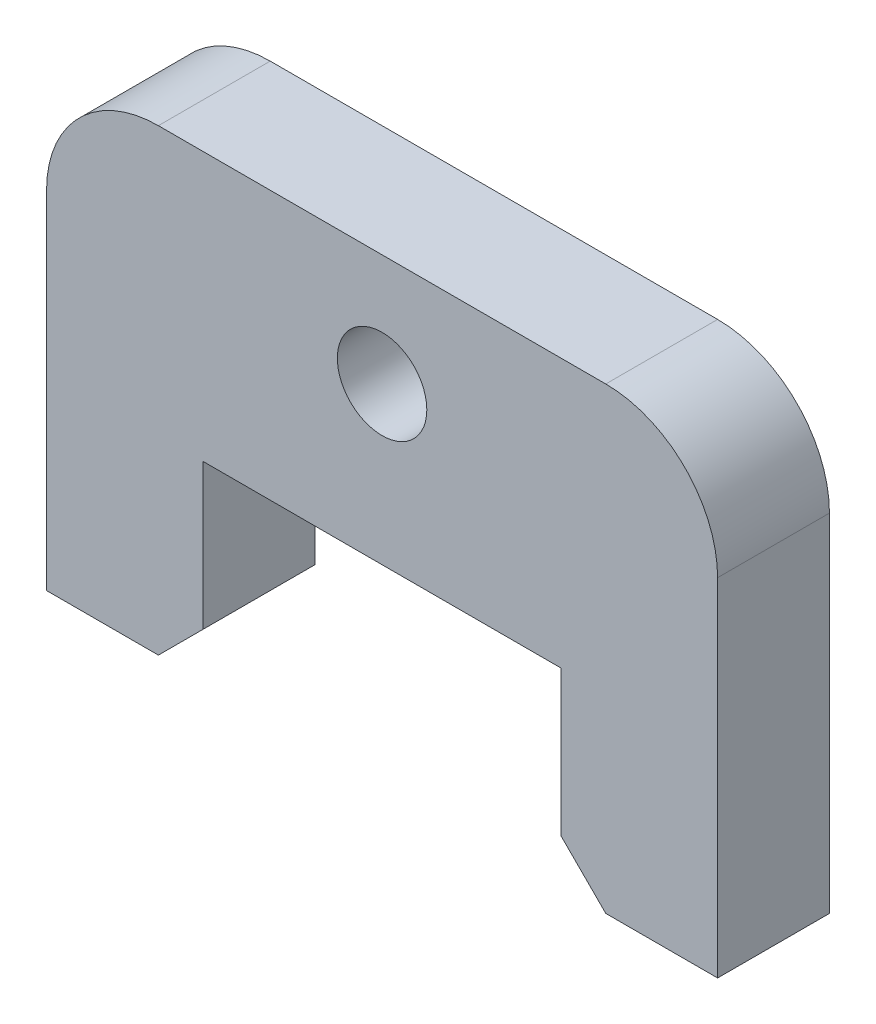
ISO-10303-21;
HEADER;
FILE_DESCRIPTION(('STEP AP214'),'2;1');
FILE_NAME('part.step','',(''),(''),'','','');
FILE_SCHEMA(('AUTOMOTIVE_DESIGN { 1 0 10303 214 1 1 1 1 }'));
ENDSEC;
DATA;
#1=APPLICATION_CONTEXT('core data for automotive mechanical design processes');
#2=APPLICATION_PROTOCOL_DEFINITION('international standard','automotive_design',2000,#1);
#3=PRODUCT_CONTEXT('',#1,'mechanical');
#4=PRODUCT('Part','Part','',(#3));
#5=PRODUCT_RELATED_PRODUCT_CATEGORY('part','',(#4));
#6=PRODUCT_DEFINITION_FORMATION('','',#4);
#7=PRODUCT_DEFINITION_CONTEXT('part definition',#1,'design');
#8=PRODUCT_DEFINITION('design','',#6,#7);
#9=PRODUCT_DEFINITION_SHAPE('','',#8);
#10=(LENGTH_UNIT() NAMED_UNIT(*) SI_UNIT(.MILLI.,.METRE.));
#11=(NAMED_UNIT(*) PLANE_ANGLE_UNIT() SI_UNIT($,.RADIAN.));
#12=(NAMED_UNIT(*) SI_UNIT($,.STERADIAN.) SOLID_ANGLE_UNIT());
#13=UNCERTAINTY_MEASURE_WITH_UNIT(LENGTH_MEASURE(1.E-05),#10,'distance_accuracy_value','');
#14=(GEOMETRIC_REPRESENTATION_CONTEXT(3) GLOBAL_UNCERTAINTY_ASSIGNED_CONTEXT((#13)) GLOBAL_UNIT_ASSIGNED_CONTEXT((#10,
#11,#12)) REPRESENTATION_CONTEXT('',''));
#15=CARTESIAN_POINT('',(0.,0.,0.));
#16=DIRECTION('',(0.,0.,1.));
#17=DIRECTION('',(1.,0.,0.));
#18=AXIS2_PLACEMENT_3D('',#15,#16,#17);
#19=CARTESIAN_POINT('',(50.0044487630317,31.,10.));
#20=DIRECTION('',(0.,0.,1.));
#21=DIRECTION('',(1.,0.,0.));
#22=AXIS2_PLACEMENT_3D('',#19,#20,#21);
#23=PLANE('',#22);
#24=DIRECTION('',(1.,0.,0.));
#25=VECTOR('',#24,1.);
#26=CARTESIAN_POINT('',(0.,0.,10.));
#27=LINE('',#26,#25);
#28=CARTESIAN_POINT('',(0.,0.,10.));
#29=VERTEX_POINT('',#28);
#30=CARTESIAN_POINT('',(10.,0.,10.));
#31=VERTEX_POINT('',#30);
#32=EDGE_CURVE('E183',#29,#31,#27,.T.);
#33=ORIENTED_EDGE('',*,*,#32,.T.);
#34=DIRECTION('',(0.707106781186548,0.707106781186547,0.));
#35=VECTOR('',#34,1.);
#36=CARTESIAN_POINT('',(10.,0.,10.));
#37=LINE('',#36,#35);
#38=CARTESIAN_POINT('',(14.0022243815159,4.00222438151586,10.));
#39=VERTEX_POINT('',#38);
#40=EDGE_CURVE('E111',#31,#39,#37,.T.);
#41=ORIENTED_EDGE('',*,*,#40,.T.);
#42=DIRECTION('',(0.,1.,0.));
#43=VECTOR('',#42,1.);
#44=CARTESIAN_POINT('',(14.0022243815159,4.00222438151586,10.));
#45=LINE('',#44,#43);
#46=CARTESIAN_POINT('',(14.0022243815159,17.,10.));
#47=VERTEX_POINT('',#46);
#48=EDGE_CURVE('E210',#39,#47,#45,.T.);
#49=ORIENTED_EDGE('',*,*,#48,.T.);
#50=DIRECTION('',(1.,0.,0.));
#51=VECTOR('',#50,1.);
#52=CARTESIAN_POINT('',(14.0022243815159,17.,10.));
#53=LINE('',#52,#51);
#54=CARTESIAN_POINT('',(46.0022243815159,17.,10.));
#55=VERTEX_POINT('',#54);
#56=EDGE_CURVE('E229',#47,#55,#53,.T.);
#57=ORIENTED_EDGE('',*,*,#56,.T.);
#58=DIRECTION('',(0.,-1.,0.));
#59=VECTOR('',#58,1.);
#60=CARTESIAN_POINT('',(46.0022243815159,17.,10.));
#61=LINE('',#60,#59);
#62=CARTESIAN_POINT('',(46.0022243815159,4.00222438151586,10.));
#63=VERTEX_POINT('',#62);
#64=EDGE_CURVE('E226',#55,#63,#61,.T.);
#65=ORIENTED_EDGE('',*,*,#64,.T.);
#66=DIRECTION('',(0.707106781186548,-0.707106781186548,0.));
#67=VECTOR('',#66,1.);
#68=CARTESIAN_POINT('',(46.0022243815159,4.00222438151586,10.));
#69=LINE('',#68,#67);
#70=CARTESIAN_POINT('',(50.0044487630317,0.,10.));
#71=VERTEX_POINT('',#70);
#72=EDGE_CURVE('E228',#63,#71,#69,.T.);
#73=ORIENTED_EDGE('',*,*,#72,.T.);
#74=DIRECTION('',(1.,0.,0.));
#75=VECTOR('',#74,1.);
#76=CARTESIAN_POINT('',(50.0044487630317,0.,10.));
#77=LINE('',#76,#75);
#78=CARTESIAN_POINT('',(60.0044487630317,0.,10.));
#79=VERTEX_POINT('',#78);
#80=EDGE_CURVE('E231',#71,#79,#77,.T.);
#81=ORIENTED_EDGE('',*,*,#80,.T.);
#82=DIRECTION('',(0.,1.,0.));
#83=VECTOR('',#82,1.);
#84=CARTESIAN_POINT('',(60.0044487630317,0.,10.));
#85=LINE('',#84,#83);
#86=CARTESIAN_POINT('',(60.0044487630317,30.9999999999999,10.));
#87=VERTEX_POINT('',#86);
#88=EDGE_CURVE('E237',#79,#87,#85,.T.);
#89=ORIENTED_EDGE('',*,*,#88,.T.);
#90=CARTESIAN_POINT('',(50.0044487630317,31.,10.));
#91=DIRECTION('',(0.,0.,1.));
#92=DIRECTION('',(1.,0.,0.));
#93=AXIS2_PLACEMENT_3D('',#90,#91,#92);
#94=CIRCLE('',#93,10.);
#95=CARTESIAN_POINT('',(50.0044487630317,41.,10.));
#96=VERTEX_POINT('',#95);
#97=EDGE_CURVE('E142',#87,#96,#94,.T.);
#98=ORIENTED_EDGE('',*,*,#97,.T.);
#99=DIRECTION('',(-1.,0.,0.));
#100=VECTOR('',#99,1.);
#101=CARTESIAN_POINT('',(50.0044487630317,41.,10.));
#102=LINE('',#101,#100);
#103=CARTESIAN_POINT('',(10.0000000000001,41.,10.));
#104=VERTEX_POINT('',#103);
#105=EDGE_CURVE('E136',#96,#104,#102,.T.);
#106=ORIENTED_EDGE('',*,*,#105,.T.);
#107=CARTESIAN_POINT('',(10.,31.,10.));
#108=DIRECTION('',(0.,0.,1.));
#109=DIRECTION('',(-1.,0.,0.));
#110=AXIS2_PLACEMENT_3D('',#107,#108,#109);
#111=CIRCLE('',#110,10.);
#112=CARTESIAN_POINT('',(0.,30.9999999999999,10.));
#113=VERTEX_POINT('',#112);
#114=EDGE_CURVE('E140',#104,#113,#111,.T.);
#115=ORIENTED_EDGE('',*,*,#114,.T.);
#116=DIRECTION('',(0.,-1.,0.));
#117=VECTOR('',#116,1.);
#118=CARTESIAN_POINT('',(0.,0.,10.));
#119=LINE('',#118,#117);
#120=EDGE_CURVE('E56',#113,#29,#119,.T.);
#121=ORIENTED_EDGE('',*,*,#120,.T.);
#122=EDGE_LOOP('',(#33,#41,#49,#57,#65,#73,#81,#89,#98,#106,#115,#121));
#123=FACE_BOUND('',#122,.T.);
#124=CARTESIAN_POINT('',(30.0022243815159,31.,10.));
#125=DIRECTION('',(0.,0.,1.));
#126=DIRECTION('',(1.,0.,0.));
#127=AXIS2_PLACEMENT_3D('',#124,#125,#126);
#128=CIRCLE('',#127,4.00000000000001);
#129=CARTESIAN_POINT('',(34.0022243815159,31.,10.));
#130=VERTEX_POINT('',#129);
#131=EDGE_CURVE('E164',#130,#130,#128,.T.);
#132=ORIENTED_EDGE('',*,*,#131,.F.);
#133=EDGE_LOOP('',(#132));
#134=FACE_BOUND('',#133,.T.);
#135=ADVANCED_FACE('F39',(#123,#134),#23,.T.);
#136=CARTESIAN_POINT('',(50.0044487630317,31.,0.));
#137=DIRECTION('',(0.,0.,1.));
#138=DIRECTION('',(1.,0.,0.));
#139=AXIS2_PLACEMENT_3D('',#136,#137,#138);
#140=PLANE('',#139);
#141=DIRECTION('',(1.,0.,0.));
#142=VECTOR('',#141,1.);
#143=CARTESIAN_POINT('',(0.,0.,0.));
#144=LINE('',#143,#142);
#145=CARTESIAN_POINT('',(0.,0.,0.));
#146=VERTEX_POINT('',#145);
#147=CARTESIAN_POINT('',(10.,0.,0.));
#148=VERTEX_POINT('',#147);
#149=EDGE_CURVE('E160',#146,#148,#144,.T.);
#150=ORIENTED_EDGE('',*,*,#149,.F.);
#151=DIRECTION('',(0.,-1.,0.));
#152=VECTOR('',#151,1.);
#153=CARTESIAN_POINT('',(0.,0.,0.));
#154=LINE('',#153,#152);
#155=CARTESIAN_POINT('',(0.,30.9999999999999,0.));
#156=VERTEX_POINT('',#155);
#157=EDGE_CURVE('E103',#156,#146,#154,.T.);
#158=ORIENTED_EDGE('',*,*,#157,.F.);
#159=CARTESIAN_POINT('',(10.,31.,0.));
#160=DIRECTION('',(0.,0.,1.));
#161=DIRECTION('',(-1.,0.,0.));
#162=AXIS2_PLACEMENT_3D('',#159,#160,#161);
#163=CIRCLE('',#162,10.);
#164=CARTESIAN_POINT('',(10.0000000000001,41.,0.));
#165=VERTEX_POINT('',#164);
#166=EDGE_CURVE('E97',#165,#156,#163,.T.);
#167=ORIENTED_EDGE('',*,*,#166,.F.);
#168=DIRECTION('',(-1.,0.,0.));
#169=VECTOR('',#168,1.);
#170=CARTESIAN_POINT('',(50.0044487630317,41.,0.));
#171=LINE('',#170,#169);
#172=CARTESIAN_POINT('',(50.0044487630317,41.,0.));
#173=VERTEX_POINT('',#172);
#174=EDGE_CURVE('E150',#173,#165,#171,.T.);
#175=ORIENTED_EDGE('',*,*,#174,.F.);
#176=CARTESIAN_POINT('',(50.0044487630317,31.,0.));
#177=DIRECTION('',(0.,0.,1.));
#178=DIRECTION('',(1.,0.,0.));
#179=AXIS2_PLACEMENT_3D('',#176,#177,#178);
#180=CIRCLE('',#179,10.);
#181=CARTESIAN_POINT('',(60.0044487630317,30.9999999999999,0.));
#182=VERTEX_POINT('',#181);
#183=EDGE_CURVE('E178',#182,#173,#180,.T.);
#184=ORIENTED_EDGE('',*,*,#183,.F.);
#185=DIRECTION('',(0.,1.,0.));
#186=VECTOR('',#185,1.);
#187=CARTESIAN_POINT('',(60.0044487630317,0.,0.));
#188=LINE('',#187,#186);
#189=CARTESIAN_POINT('',(60.0044487630317,0.,0.));
#190=VERTEX_POINT('',#189);
#191=EDGE_CURVE('E176',#190,#182,#188,.T.);
#192=ORIENTED_EDGE('',*,*,#191,.F.);
#193=DIRECTION('',(1.,0.,0.));
#194=VECTOR('',#193,1.);
#195=CARTESIAN_POINT('',(50.0044487630317,0.,0.));
#196=LINE('',#195,#194);
#197=CARTESIAN_POINT('',(50.0044487630317,0.,0.));
#198=VERTEX_POINT('',#197);
#199=EDGE_CURVE('E174',#198,#190,#196,.T.);
#200=ORIENTED_EDGE('',*,*,#199,.F.);
#201=DIRECTION('',(0.707106781186548,-0.707106781186548,0.));
#202=VECTOR('',#201,1.);
#203=CARTESIAN_POINT('',(46.0022243815159,4.00222438151586,0.));
#204=LINE('',#203,#202);
#205=CARTESIAN_POINT('',(46.0022243815159,4.00222438151586,0.));
#206=VERTEX_POINT('',#205);
#207=EDGE_CURVE('E172',#206,#198,#204,.T.);
#208=ORIENTED_EDGE('',*,*,#207,.F.);
#209=DIRECTION('',(0.,-1.,0.));
#210=VECTOR('',#209,1.);
#211=CARTESIAN_POINT('',(46.0022243815159,17.,0.));
#212=LINE('',#211,#210);
#213=CARTESIAN_POINT('',(46.0022243815159,17.,0.));
#214=VERTEX_POINT('',#213);
#215=EDGE_CURVE('E170',#214,#206,#212,.T.);
#216=ORIENTED_EDGE('',*,*,#215,.F.);
#217=DIRECTION('',(1.,0.,0.));
#218=VECTOR('',#217,1.);
#219=CARTESIAN_POINT('',(14.0022243815159,17.,0.));
#220=LINE('',#219,#218);
#221=CARTESIAN_POINT('',(14.0022243815159,17.,0.));
#222=VERTEX_POINT('',#221);
#223=EDGE_CURVE('E168',#222,#214,#220,.T.);
#224=ORIENTED_EDGE('',*,*,#223,.F.);
#225=DIRECTION('',(0.,1.,0.));
#226=VECTOR('',#225,1.);
#227=CARTESIAN_POINT('',(14.0022243815159,4.00222438151586,0.));
#228=LINE('',#227,#226);
#229=CARTESIAN_POINT('',(14.0022243815159,4.00222438151586,0.));
#230=VERTEX_POINT('',#229);
#231=EDGE_CURVE('E166',#230,#222,#228,.T.);
#232=ORIENTED_EDGE('',*,*,#231,.F.);
#233=DIRECTION('',(0.707106781186548,0.707106781186547,0.));
#234=VECTOR('',#233,1.);
#235=CARTESIAN_POINT('',(10.,0.,0.));
#236=LINE('',#235,#234);
#237=EDGE_CURVE('E163',#148,#230,#236,.T.);
#238=ORIENTED_EDGE('',*,*,#237,.F.);
#239=EDGE_LOOP('',(#150,#158,#167,#175,#184,#192,#200,#208,#216,#224,#232,#238));
#240=FACE_BOUND('',#239,.T.);
#241=CARTESIAN_POINT('',(30.0022243815159,31.,0.));
#242=DIRECTION('',(0.,0.,1.));
#243=DIRECTION('',(1.,0.,0.));
#244=AXIS2_PLACEMENT_3D('',#241,#242,#243);
#245=CIRCLE('',#244,4.00000000000001);
#246=CARTESIAN_POINT('',(34.0022243815159,31.,0.));
#247=VERTEX_POINT('',#246);
#248=EDGE_CURVE('E299',#247,#247,#245,.T.);
#249=ORIENTED_EDGE('',*,*,#248,.T.);
#250=EDGE_LOOP('',(#249));
#251=FACE_BOUND('',#250,.T.);
#252=ADVANCED_FACE('F214',(#240,#251),#140,.F.);
#253=CARTESIAN_POINT('',(0.,0.,10.));
#254=DIRECTION('',(0.,1.,0.));
#255=DIRECTION('',(0.,0.,1.));
#256=AXIS2_PLACEMENT_3D('',#253,#254,#255);
#257=PLANE('',#256);
#258=CARTESIAN_POINT('',(5.,0.,5.));
#259=DIRECTION('',(0.,-1.,0.));
#260=DIRECTION('',(0.,0.,-1.));
#261=AXIS2_PLACEMENT_3D('',#258,#259,#260);
#262=CIRCLE('',#261,2.5);
#263=CARTESIAN_POINT('',(5.,0.,2.5));
#264=VERTEX_POINT('',#263);
#265=EDGE_CURVE('E290',#264,#264,#262,.T.);
#266=ORIENTED_EDGE('',*,*,#265,.F.);
#267=EDGE_LOOP('',(#266));
#268=FACE_BOUND('',#267,.T.);
#269=ORIENTED_EDGE('',*,*,#149,.T.);
#270=DIRECTION('',(0.,0.,-1.));
#271=VECTOR('',#270,1.);
#272=CARTESIAN_POINT('',(10.,0.,10.));
#273=LINE('',#272,#271);
#274=EDGE_CURVE('E11',#31,#148,#273,.T.);
#275=ORIENTED_EDGE('',*,*,#274,.F.);
#276=ORIENTED_EDGE('',*,*,#32,.F.);
#277=DIRECTION('',(0.,0.,-1.));
#278=VECTOR('',#277,1.);
#279=CARTESIAN_POINT('',(0.,0.,10.));
#280=LINE('',#279,#278);
#281=EDGE_CURVE('E156',#29,#146,#280,.T.);
#282=ORIENTED_EDGE('',*,*,#281,.T.);
#283=EDGE_LOOP('',(#269,#275,#276,#282));
#284=FACE_BOUND('',#283,.T.);
#285=ADVANCED_FACE('F41',(#268,#284),#257,.F.);
#286=CARTESIAN_POINT('',(10.,0.,10.));
#287=DIRECTION('',(-0.707106781186547,0.707106781186548,0.));
#288=DIRECTION('',(-0.707106781186548,-0.707106781186547,0.));
#289=AXIS2_PLACEMENT_3D('',#286,#287,#288);
#290=PLANE('',#289);
#291=ORIENTED_EDGE('',*,*,#237,.T.);
#292=DIRECTION('',(0.,0.,-1.));
#293=VECTOR('',#292,1.);
#294=CARTESIAN_POINT('',(14.0022243815159,4.00222438151586,10.));
#295=LINE('',#294,#293);
#296=EDGE_CURVE('E48',#39,#230,#295,.T.);
#297=ORIENTED_EDGE('',*,*,#296,.F.);
#298=ORIENTED_EDGE('',*,*,#40,.F.);
#299=ORIENTED_EDGE('',*,*,#274,.T.);
#300=EDGE_LOOP('',(#291,#297,#298,#299));
#301=FACE_BOUND('',#300,.T.);
#302=ADVANCED_FACE('F333',(#301),#290,.F.);
#303=CARTESIAN_POINT('',(14.0022243815159,4.00222438151586,10.));
#304=DIRECTION('',(-1.,0.,0.));
#305=DIRECTION('',(0.,0.,1.));
#306=AXIS2_PLACEMENT_3D('',#303,#304,#305);
#307=PLANE('',#306);
#308=ORIENTED_EDGE('',*,*,#231,.T.);
#309=DIRECTION('',(0.,0.,-1.));
#310=VECTOR('',#309,1.);
#311=CARTESIAN_POINT('',(14.0022243815159,17.,10.));
#312=LINE('',#311,#310);
#313=EDGE_CURVE('E202',#47,#222,#312,.T.);
#314=ORIENTED_EDGE('',*,*,#313,.F.);
#315=ORIENTED_EDGE('',*,*,#48,.F.);
#316=ORIENTED_EDGE('',*,*,#296,.T.);
#317=EDGE_LOOP('',(#308,#314,#315,#316));
#318=FACE_BOUND('',#317,.T.);
#319=ADVANCED_FACE('F208',(#318),#307,.F.);
#320=CARTESIAN_POINT('',(14.0022243815159,17.,10.));
#321=DIRECTION('',(0.,1.,0.));
#322=DIRECTION('',(0.,0.,1.));
#323=AXIS2_PLACEMENT_3D('',#320,#321,#322);
#324=PLANE('',#323);
#325=ORIENTED_EDGE('',*,*,#223,.T.);
#326=DIRECTION('',(0.,0.,-1.));
#327=VECTOR('',#326,1.);
#328=CARTESIAN_POINT('',(46.0022243815159,17.,10.));
#329=LINE('',#328,#327);
#330=EDGE_CURVE('E199',#55,#214,#329,.T.);
#331=ORIENTED_EDGE('',*,*,#330,.F.);
#332=ORIENTED_EDGE('',*,*,#56,.F.);
#333=ORIENTED_EDGE('',*,*,#313,.T.);
#334=EDGE_LOOP('',(#325,#331,#332,#333));
#335=FACE_BOUND('',#334,.T.);
#336=ADVANCED_FACE('F220',(#335),#324,.F.);
#337=CARTESIAN_POINT('',(46.0022243815159,17.,10.));
#338=DIRECTION('',(1.,0.,0.));
#339=DIRECTION('',(0.,0.,-1.));
#340=AXIS2_PLACEMENT_3D('',#337,#338,#339);
#341=PLANE('',#340);
#342=ORIENTED_EDGE('',*,*,#215,.T.);
#343=DIRECTION('',(0.,0.,-1.));
#344=VECTOR('',#343,1.);
#345=CARTESIAN_POINT('',(46.0022243815159,4.00222438151586,10.));
#346=LINE('',#345,#344);
#347=EDGE_CURVE('E196',#63,#206,#346,.T.);
#348=ORIENTED_EDGE('',*,*,#347,.F.);
#349=ORIENTED_EDGE('',*,*,#64,.F.);
#350=ORIENTED_EDGE('',*,*,#330,.T.);
#351=EDGE_LOOP('',(#342,#348,#349,#350));
#352=FACE_BOUND('',#351,.T.);
#353=ADVANCED_FACE('F224',(#352),#341,.F.);
#354=CARTESIAN_POINT('',(46.0022243815159,4.00222438151586,10.));
#355=DIRECTION('',(0.707106781186548,0.707106781186548,0.));
#356=DIRECTION('',(-0.707106781186548,0.707106781186548,0.));
#357=AXIS2_PLACEMENT_3D('',#354,#355,#356);
#358=PLANE('',#357);
#359=ORIENTED_EDGE('',*,*,#207,.T.);
#360=DIRECTION('',(0.,0.,-1.));
#361=VECTOR('',#360,1.);
#362=CARTESIAN_POINT('',(50.0044487630317,0.,10.));
#363=LINE('',#362,#361);
#364=EDGE_CURVE('E193',#71,#198,#363,.T.);
#365=ORIENTED_EDGE('',*,*,#364,.F.);
#366=ORIENTED_EDGE('',*,*,#72,.F.);
#367=ORIENTED_EDGE('',*,*,#347,.T.);
#368=EDGE_LOOP('',(#359,#365,#366,#367));
#369=FACE_BOUND('',#368,.T.);
#370=ADVANCED_FACE('F316',(#369),#358,.F.);
#371=CARTESIAN_POINT('',(50.0044487630317,0.,10.));
#372=DIRECTION('',(0.,1.,0.));
#373=DIRECTION('',(0.,0.,1.));
#374=AXIS2_PLACEMENT_3D('',#371,#372,#373);
#375=PLANE('',#374);
#376=CARTESIAN_POINT('',(55.0044487630317,0.,5.));
#377=DIRECTION('',(0.,-1.,0.));
#378=DIRECTION('',(0.,0.,-1.));
#379=AXIS2_PLACEMENT_3D('',#376,#377,#378);
#380=CIRCLE('',#379,2.5);
#381=CARTESIAN_POINT('',(55.0044487630317,0.,2.5));
#382=VERTEX_POINT('',#381);
#383=EDGE_CURVE('E289',#382,#382,#380,.T.);
#384=ORIENTED_EDGE('',*,*,#383,.F.);
#385=EDGE_LOOP('',(#384));
#386=FACE_BOUND('',#385,.T.);
#387=ORIENTED_EDGE('',*,*,#199,.T.);
#388=DIRECTION('',(0.,0.,-1.));
#389=VECTOR('',#388,1.);
#390=CARTESIAN_POINT('',(60.0044487630317,0.,10.));
#391=LINE('',#390,#389);
#392=EDGE_CURVE('E190',#79,#190,#391,.T.);
#393=ORIENTED_EDGE('',*,*,#392,.F.);
#394=ORIENTED_EDGE('',*,*,#80,.F.);
#395=ORIENTED_EDGE('',*,*,#364,.T.);
#396=EDGE_LOOP('',(#387,#393,#394,#395));
#397=FACE_BOUND('',#396,.T.);
#398=ADVANCED_FACE('F313',(#386,#397),#375,.F.);
#399=CARTESIAN_POINT('',(60.0044487630317,0.,10.));
#400=DIRECTION('',(-1.,0.,0.));
#401=DIRECTION('',(0.,0.,1.));
#402=AXIS2_PLACEMENT_3D('',#399,#400,#401);
#403=PLANE('',#402);
#404=ORIENTED_EDGE('',*,*,#191,.T.);
#405=DIRECTION('',(0.,0.,-1.));
#406=VECTOR('',#405,1.);
#407=CARTESIAN_POINT('',(60.0044487630317,30.9999999999999,10.));
#408=LINE('',#407,#406);
#409=EDGE_CURVE('E187',#87,#182,#408,.T.);
#410=ORIENTED_EDGE('',*,*,#409,.F.);
#411=ORIENTED_EDGE('',*,*,#88,.F.);
#412=ORIENTED_EDGE('',*,*,#392,.T.);
#413=EDGE_LOOP('',(#404,#410,#411,#412));
#414=FACE_BOUND('',#413,.T.);
#415=ADVANCED_FACE('F243',(#414),#403,.F.);
#416=CARTESIAN_POINT('',(50.0044487630317,31.,10.));
#417=DIRECTION('',(0.,0.,-1.));
#418=DIRECTION('',(-1.,0.,0.));
#419=AXIS2_PLACEMENT_3D('',#416,#417,#418);
#420=CYLINDRICAL_SURFACE('',#419,10.);
#421=ORIENTED_EDGE('',*,*,#183,.T.);
#422=DIRECTION('',(0.,0.,-1.));
#423=VECTOR('',#422,1.);
#424=CARTESIAN_POINT('',(50.0044487630317,41.,10.));
#425=LINE('',#424,#423);
#426=EDGE_CURVE('E151',#96,#173,#425,.T.);
#427=ORIENTED_EDGE('',*,*,#426,.F.);
#428=ORIENTED_EDGE('',*,*,#97,.F.);
#429=ORIENTED_EDGE('',*,*,#409,.T.);
#430=EDGE_LOOP('',(#421,#427,#428,#429));
#431=FACE_BOUND('',#430,.T.);
#432=ADVANCED_FACE('F247',(#431),#420,.T.);
#433=CARTESIAN_POINT('',(50.0044487630317,41.,10.));
#434=DIRECTION('',(0.,-1.,0.));
#435=DIRECTION('',(1.,0.,0.));
#436=AXIS2_PLACEMENT_3D('',#433,#434,#435);
#437=PLANE('',#436);
#438=ORIENTED_EDGE('',*,*,#174,.T.);
#439=DIRECTION('',(0.,0.,-1.));
#440=VECTOR('',#439,1.);
#441=CARTESIAN_POINT('',(10.0000000000001,41.,10.));
#442=LINE('',#441,#440);
#443=EDGE_CURVE('E147',#104,#165,#442,.T.);
#444=ORIENTED_EDGE('',*,*,#443,.F.);
#445=ORIENTED_EDGE('',*,*,#105,.F.);
#446=ORIENTED_EDGE('',*,*,#426,.T.);
#447=EDGE_LOOP('',(#438,#444,#445,#446));
#448=FACE_BOUND('',#447,.T.);
#449=ADVANCED_FACE('F148',(#448),#437,.F.);
#450=CARTESIAN_POINT('',(10.,31.,10.));
#451=DIRECTION('',(0.,0.,-1.));
#452=DIRECTION('',(-1.,0.,0.));
#453=AXIS2_PLACEMENT_3D('',#450,#451,#452);
#454=CYLINDRICAL_SURFACE('',#453,10.);
#455=ORIENTED_EDGE('',*,*,#166,.T.);
#456=DIRECTION('',(0.,0.,-1.));
#457=VECTOR('',#456,1.);
#458=CARTESIAN_POINT('',(0.,30.9999999999999,10.));
#459=LINE('',#458,#457);
#460=EDGE_CURVE('E152',#113,#156,#459,.T.);
#461=ORIENTED_EDGE('',*,*,#460,.F.);
#462=ORIENTED_EDGE('',*,*,#114,.F.);
#463=ORIENTED_EDGE('',*,*,#443,.T.);
#464=EDGE_LOOP('',(#455,#461,#462,#463));
#465=FACE_BOUND('',#464,.T.);
#466=ADVANCED_FACE('F154',(#465),#454,.T.);
#467=CARTESIAN_POINT('',(0.,0.,10.));
#468=DIRECTION('',(1.,0.,0.));
#469=DIRECTION('',(0.,0.,-1.));
#470=AXIS2_PLACEMENT_3D('',#467,#468,#469);
#471=PLANE('',#470);
#472=ORIENTED_EDGE('',*,*,#157,.T.);
#473=ORIENTED_EDGE('',*,*,#281,.F.);
#474=ORIENTED_EDGE('',*,*,#120,.F.);
#475=ORIENTED_EDGE('',*,*,#460,.T.);
#476=EDGE_LOOP('',(#472,#473,#474,#475));
#477=FACE_BOUND('',#476,.T.);
#478=ADVANCED_FACE('F251',(#477),#471,.F.);
#479=CARTESIAN_POINT('',(30.0022243815159,31.,10.));
#480=DIRECTION('',(0.,0.,-1.));
#481=DIRECTION('',(-1.,0.,0.));
#482=AXIS2_PLACEMENT_3D('',#479,#480,#481);
#483=CYLINDRICAL_SURFACE('',#482,4.00000000000001);
#484=ORIENTED_EDGE('',*,*,#131,.T.);
#485=EDGE_LOOP('',(#484));
#486=FACE_BOUND('',#485,.T.);
#487=ORIENTED_EDGE('',*,*,#248,.F.);
#488=EDGE_LOOP('',(#487));
#489=FACE_BOUND('',#488,.T.);
#490=ADVANCED_FACE('F253',(#486,#489),#483,.F.);
#491=CARTESIAN_POINT('',(55.0044487630317,8.,5.));
#492=DIRECTION('',(0.,-1.,0.));
#493=DIRECTION('',(0.,0.,-1.));
#494=AXIS2_PLACEMENT_3D('',#491,#492,#493);
#495=CYLINDRICAL_SURFACE('',#494,2.5);
#496=CARTESIAN_POINT('',(55.0044487630317,8.,5.));
#497=DIRECTION('',(0.,-1.,0.));
#498=DIRECTION('',(0.,0.,-1.));
#499=AXIS2_PLACEMENT_3D('',#496,#497,#498);
#500=CIRCLE('',#499,2.5);
#501=CARTESIAN_POINT('',(55.0044487630317,8.,2.5));
#502=VERTEX_POINT('',#501);
#503=EDGE_CURVE('E293',#502,#502,#500,.T.);
#504=ORIENTED_EDGE('',*,*,#503,.F.);
#505=EDGE_LOOP('',(#504));
#506=FACE_BOUND('',#505,.T.);
#507=ORIENTED_EDGE('',*,*,#383,.T.);
#508=EDGE_LOOP('',(#507));
#509=FACE_BOUND('',#508,.T.);
#510=ADVANCED_FACE('F259',(#506,#509),#495,.F.);
#511=CARTESIAN_POINT('',(55.0044487630317,8.,5.));
#512=DIRECTION('',(0.,-1.,0.));
#513=DIRECTION('',(0.,0.,-1.));
#514=AXIS2_PLACEMENT_3D('',#511,#512,#513);
#515=PLANE('',#514);
#516=ORIENTED_EDGE('',*,*,#503,.T.);
#517=EDGE_LOOP('',(#516));
#518=FACE_BOUND('',#517,.T.);
#519=ADVANCED_FACE('F272',(#518),#515,.T.);
#520=CARTESIAN_POINT('',(5.,8.,5.));
#521=DIRECTION('',(0.,-1.,0.));
#522=DIRECTION('',(0.,0.,-1.));
#523=AXIS2_PLACEMENT_3D('',#520,#521,#522);
#524=CYLINDRICAL_SURFACE('',#523,2.5);
#525=CARTESIAN_POINT('',(5.,8.,5.));
#526=DIRECTION('',(0.,-1.,0.));
#527=DIRECTION('',(0.,0.,-1.));
#528=AXIS2_PLACEMENT_3D('',#525,#526,#527);
#529=CIRCLE('',#528,2.5);
#530=CARTESIAN_POINT('',(5.,8.,2.5));
#531=VERTEX_POINT('',#530);
#532=EDGE_CURVE('E288',#531,#531,#529,.T.);
#533=ORIENTED_EDGE('',*,*,#532,.F.);
#534=EDGE_LOOP('',(#533));
#535=FACE_BOUND('',#534,.T.);
#536=ORIENTED_EDGE('',*,*,#265,.T.);
#537=EDGE_LOOP('',(#536));
#538=FACE_BOUND('',#537,.T.);
#539=ADVANCED_FACE('F276',(#535,#538),#524,.F.);
#540=CARTESIAN_POINT('',(5.,8.,5.));
#541=DIRECTION('',(0.,-1.,0.));
#542=DIRECTION('',(0.,0.,-1.));
#543=AXIS2_PLACEMENT_3D('',#540,#541,#542);
#544=PLANE('',#543);
#545=ORIENTED_EDGE('',*,*,#532,.T.);
#546=EDGE_LOOP('',(#545));
#547=FACE_BOUND('',#546,.T.);
#548=ADVANCED_FACE('F280',(#547),#544,.T.);
#549=CLOSED_SHELL('',(#135,#252,#285,#302,#319,#336,#353,#370,#398,#415,#432,#449,#466,#478,
#490,#510,#519,#539,#548));
#550=MANIFOLD_SOLID_BREP('B2',#549);
#551=ADVANCED_BREP_SHAPE_REPRESENTATION('',(#18,#550),#14);
#552=SHAPE_DEFINITION_REPRESENTATION(#9,#551);
ENDSEC;
END-ISO-10303-21;
